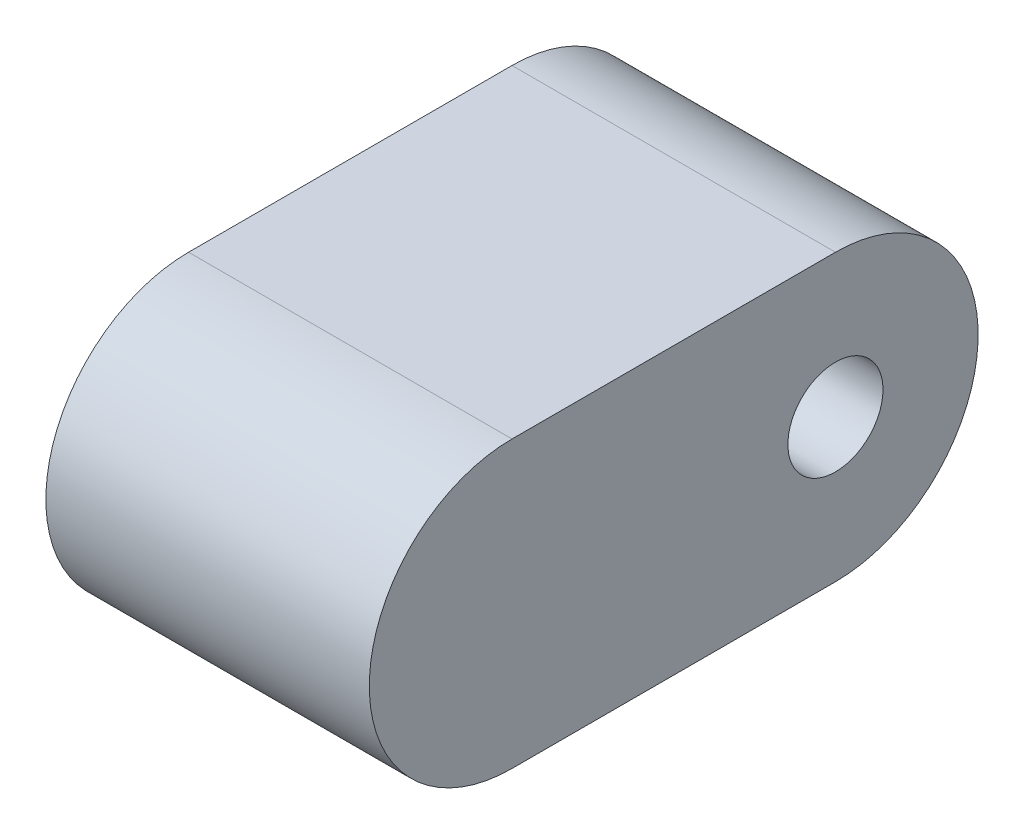
ISO-10303-21;
HEADER;
FILE_DESCRIPTION(('STEP AP214'),'2;1');
FILE_NAME('part.step','',(''),(''),'','','');
FILE_SCHEMA(('AUTOMOTIVE_DESIGN { 1 0 10303 214 1 1 1 1 }'));
ENDSEC;
DATA;
#1=APPLICATION_CONTEXT('core data for automotive mechanical design processes');
#2=APPLICATION_PROTOCOL_DEFINITION('international standard','automotive_design',2000,#1);
#3=PRODUCT_CONTEXT('',#1,'mechanical');
#4=PRODUCT('Part','Part','',(#3));
#5=PRODUCT_RELATED_PRODUCT_CATEGORY('part','',(#4));
#6=PRODUCT_DEFINITION_FORMATION('','',#4);
#7=PRODUCT_DEFINITION_CONTEXT('part definition',#1,'design');
#8=PRODUCT_DEFINITION('design','',#6,#7);
#9=PRODUCT_DEFINITION_SHAPE('','',#8);
#10=(LENGTH_UNIT() NAMED_UNIT(*) SI_UNIT(.MILLI.,.METRE.));
#11=(NAMED_UNIT(*) PLANE_ANGLE_UNIT() SI_UNIT($,.RADIAN.));
#12=(NAMED_UNIT(*) SI_UNIT($,.STERADIAN.) SOLID_ANGLE_UNIT());
#13=UNCERTAINTY_MEASURE_WITH_UNIT(LENGTH_MEASURE(1.E-05),#10,'distance_accuracy_value','');
#14=(GEOMETRIC_REPRESENTATION_CONTEXT(3) GLOBAL_UNCERTAINTY_ASSIGNED_CONTEXT((#13)) GLOBAL_UNIT_ASSIGNED_CONTEXT((#10,
#11,#12)) REPRESENTATION_CONTEXT('',''));
#15=CARTESIAN_POINT('',(0.,0.,0.));
#16=DIRECTION('',(0.,0.,1.));
#17=DIRECTION('',(1.,0.,0.));
#18=AXIS2_PLACEMENT_3D('',#15,#16,#17);
#19=CARTESIAN_POINT('',(8.5,0.,17.));
#20=DIRECTION('',(1.,0.,0.));
#21=DIRECTION('',(0.,0.,-1.));
#22=AXIS2_PLACEMENT_3D('',#19,#20,#21);
#23=PLANE('',#22);
#24=CARTESIAN_POINT('',(8.5,0.,17.));
#25=DIRECTION('',(1.,0.,0.));
#26=DIRECTION('',(0.,0.,-1.));
#27=AXIS2_PLACEMENT_3D('',#24,#25,#26);
#28=CIRCLE('',#27,7.5);
#29=CARTESIAN_POINT('',(8.5,7.5,17.));
#30=VERTEX_POINT('',#29);
#31=CARTESIAN_POINT('',(8.5,-7.5,17.));
#32=VERTEX_POINT('',#31);
#33=EDGE_CURVE('E85',#30,#32,#28,.T.);
#34=ORIENTED_EDGE('',*,*,#33,.T.);
#35=DIRECTION('',(0.,0.,-1.));
#36=VECTOR('',#35,1.);
#37=CARTESIAN_POINT('',(8.5,-7.5,0.));
#38=LINE('',#37,#36);
#39=CARTESIAN_POINT('',(8.5,-7.5,0.));
#40=VERTEX_POINT('',#39);
#41=EDGE_CURVE('E80',#32,#40,#38,.T.);
#42=ORIENTED_EDGE('',*,*,#41,.T.);
#43=CARTESIAN_POINT('',(8.5,0.,0.));
#44=DIRECTION('',(1.,0.,0.));
#45=DIRECTION('',(0.,0.,-1.));
#46=AXIS2_PLACEMENT_3D('',#43,#44,#45);
#47=CIRCLE('',#46,7.5);
#48=CARTESIAN_POINT('',(8.5,7.5,0.));
#49=VERTEX_POINT('',#48);
#50=EDGE_CURVE('E83',#40,#49,#47,.T.);
#51=ORIENTED_EDGE('',*,*,#50,.T.);
#52=DIRECTION('',(0.,0.,1.));
#53=VECTOR('',#52,1.);
#54=CARTESIAN_POINT('',(8.5,7.5,0.));
#55=LINE('',#54,#53);
#56=EDGE_CURVE('E50',#49,#30,#55,.T.);
#57=ORIENTED_EDGE('',*,*,#56,.T.);
#58=EDGE_LOOP('',(#34,#42,#51,#57));
#59=FACE_BOUND('',#58,.T.);
#60=CARTESIAN_POINT('',(8.5,0.,0.));
#61=DIRECTION('',(1.,0.,0.));
#62=DIRECTION('',(0.,0.,-1.));
#63=AXIS2_PLACEMENT_3D('',#60,#61,#62);
#64=CIRCLE('',#63,2.5);
#65=CARTESIAN_POINT('',(8.5,0.,-2.5));
#66=VERTEX_POINT('',#65);
#67=EDGE_CURVE('E100',#66,#66,#64,.T.);
#68=ORIENTED_EDGE('',*,*,#67,.F.);
#69=EDGE_LOOP('',(#68));
#70=FACE_BOUND('',#69,.T.);
#71=ADVANCED_FACE('F33',(#59,#70),#23,.T.);
#72=CARTESIAN_POINT('',(-8.5,0.,17.));
#73=DIRECTION('',(1.,0.,0.));
#74=DIRECTION('',(0.,0.,-1.));
#75=AXIS2_PLACEMENT_3D('',#72,#73,#74);
#76=PLANE('',#75);
#77=CARTESIAN_POINT('',(-8.5,0.,17.));
#78=DIRECTION('',(1.,0.,0.));
#79=DIRECTION('',(0.,0.,-1.));
#80=AXIS2_PLACEMENT_3D('',#77,#78,#79);
#81=CIRCLE('',#80,7.5);
#82=CARTESIAN_POINT('',(-8.5,7.5,17.));
#83=VERTEX_POINT('',#82);
#84=CARTESIAN_POINT('',(-8.5,-7.5,17.));
#85=VERTEX_POINT('',#84);
#86=EDGE_CURVE('E97',#83,#85,#81,.T.);
#87=ORIENTED_EDGE('',*,*,#86,.F.);
#88=DIRECTION('',(0.,0.,1.));
#89=VECTOR('',#88,1.);
#90=CARTESIAN_POINT('',(-8.5,7.5,0.));
#91=LINE('',#90,#89);
#92=CARTESIAN_POINT('',(-8.5,7.5,0.));
#93=VERTEX_POINT('',#92);
#94=EDGE_CURVE('E73',#93,#83,#91,.T.);
#95=ORIENTED_EDGE('',*,*,#94,.F.);
#96=CARTESIAN_POINT('',(-8.5,0.,0.));
#97=DIRECTION('',(1.,0.,0.));
#98=DIRECTION('',(0.,0.,-1.));
#99=AXIS2_PLACEMENT_3D('',#96,#97,#98);
#100=CIRCLE('',#99,7.5);
#101=CARTESIAN_POINT('',(-8.5,-7.5,0.));
#102=VERTEX_POINT('',#101);
#103=EDGE_CURVE('E67',#102,#93,#100,.T.);
#104=ORIENTED_EDGE('',*,*,#103,.F.);
#105=DIRECTION('',(0.,0.,-1.));
#106=VECTOR('',#105,1.);
#107=CARTESIAN_POINT('',(-8.5,-7.5,0.));
#108=LINE('',#107,#106);
#109=EDGE_CURVE('E89',#85,#102,#108,.T.);
#110=ORIENTED_EDGE('',*,*,#109,.F.);
#111=EDGE_LOOP('',(#87,#95,#104,#110));
#112=FACE_BOUND('',#111,.T.);
#113=CARTESIAN_POINT('',(-8.5,0.,0.));
#114=DIRECTION('',(1.,0.,0.));
#115=DIRECTION('',(0.,0.,-1.));
#116=AXIS2_PLACEMENT_3D('',#113,#114,#115);
#117=CIRCLE('',#116,2.5);
#118=CARTESIAN_POINT('',(-8.5,0.,-2.5));
#119=VERTEX_POINT('',#118);
#120=EDGE_CURVE('E112',#119,#119,#117,.T.);
#121=ORIENTED_EDGE('',*,*,#120,.T.);
#122=EDGE_LOOP('',(#121));
#123=FACE_BOUND('',#122,.T.);
#124=ADVANCED_FACE('F108',(#112,#123),#76,.F.);
#125=CARTESIAN_POINT('',(8.5,0.,17.));
#126=DIRECTION('',(-1.,0.,0.));
#127=DIRECTION('',(0.,0.,1.));
#128=AXIS2_PLACEMENT_3D('',#125,#126,#127);
#129=CYLINDRICAL_SURFACE('',#128,7.5);
#130=ORIENTED_EDGE('',*,*,#86,.T.);
#131=DIRECTION('',(-1.,0.,0.));
#132=VECTOR('',#131,1.);
#133=CARTESIAN_POINT('',(8.5,-7.5,17.));
#134=LINE('',#133,#132);
#135=EDGE_CURVE('E11',#32,#85,#134,.T.);
#136=ORIENTED_EDGE('',*,*,#135,.F.);
#137=ORIENTED_EDGE('',*,*,#33,.F.);
#138=DIRECTION('',(-1.,0.,0.));
#139=VECTOR('',#138,1.);
#140=CARTESIAN_POINT('',(8.5,7.5,17.));
#141=LINE('',#140,#139);
#142=EDGE_CURVE('E93',#30,#83,#141,.T.);
#143=ORIENTED_EDGE('',*,*,#142,.T.);
#144=EDGE_LOOP('',(#130,#136,#137,#143));
#145=FACE_BOUND('',#144,.T.);
#146=ADVANCED_FACE('F35',(#145),#129,.T.);
#147=CARTESIAN_POINT('',(8.5,-7.5,0.));
#148=DIRECTION('',(0.,1.,0.));
#149=DIRECTION('',(0.,0.,1.));
#150=AXIS2_PLACEMENT_3D('',#147,#148,#149);
#151=PLANE('',#150);
#152=ORIENTED_EDGE('',*,*,#109,.T.);
#153=DIRECTION('',(-1.,0.,0.));
#154=VECTOR('',#153,1.);
#155=CARTESIAN_POINT('',(8.5,-7.5,0.));
#156=LINE('',#155,#154);
#157=EDGE_CURVE('E42',#40,#102,#156,.T.);
#158=ORIENTED_EDGE('',*,*,#157,.F.);
#159=ORIENTED_EDGE('',*,*,#41,.F.);
#160=ORIENTED_EDGE('',*,*,#135,.T.);
#161=EDGE_LOOP('',(#152,#158,#159,#160));
#162=FACE_BOUND('',#161,.T.);
#163=ADVANCED_FACE('F88',(#162),#151,.F.);
#164=CARTESIAN_POINT('',(8.5,0.,0.));
#165=DIRECTION('',(-1.,0.,0.));
#166=DIRECTION('',(0.,0.,1.));
#167=AXIS2_PLACEMENT_3D('',#164,#165,#166);
#168=CYLINDRICAL_SURFACE('',#167,7.5);
#169=ORIENTED_EDGE('',*,*,#103,.T.);
#170=DIRECTION('',(-1.,0.,0.));
#171=VECTOR('',#170,1.);
#172=CARTESIAN_POINT('',(8.5,7.5,0.));
#173=LINE('',#172,#171);
#174=EDGE_CURVE('E90',#49,#93,#173,.T.);
#175=ORIENTED_EDGE('',*,*,#174,.F.);
#176=ORIENTED_EDGE('',*,*,#50,.F.);
#177=ORIENTED_EDGE('',*,*,#157,.T.);
#178=EDGE_LOOP('',(#169,#175,#176,#177));
#179=FACE_BOUND('',#178,.T.);
#180=ADVANCED_FACE('F91',(#179),#168,.T.);
#181=CARTESIAN_POINT('',(8.5,7.5,0.));
#182=DIRECTION('',(0.,-1.,0.));
#183=DIRECTION('',(0.,0.,-1.));
#184=AXIS2_PLACEMENT_3D('',#181,#182,#183);
#185=PLANE('',#184);
#186=ORIENTED_EDGE('',*,*,#94,.T.);
#187=ORIENTED_EDGE('',*,*,#142,.F.);
#188=ORIENTED_EDGE('',*,*,#56,.F.);
#189=ORIENTED_EDGE('',*,*,#174,.T.);
#190=EDGE_LOOP('',(#186,#187,#188,#189));
#191=FACE_BOUND('',#190,.T.);
#192=ADVANCED_FACE('F105',(#191),#185,.F.);
#193=CARTESIAN_POINT('',(8.5,0.,0.));
#194=DIRECTION('',(-1.,0.,0.));
#195=DIRECTION('',(0.,0.,1.));
#196=AXIS2_PLACEMENT_3D('',#193,#194,#195);
#197=CYLINDRICAL_SURFACE('',#196,2.5);
#198=ORIENTED_EDGE('',*,*,#67,.T.);
#199=EDGE_LOOP('',(#198));
#200=FACE_BOUND('',#199,.T.);
#201=ORIENTED_EDGE('',*,*,#120,.F.);
#202=EDGE_LOOP('',(#201));
#203=FACE_BOUND('',#202,.T.);
#204=ADVANCED_FACE('F118',(#200,#203),#197,.F.);
#205=CLOSED_SHELL('',(#71,#124,#146,#163,#180,#192,#204));
#206=MANIFOLD_SOLID_BREP('B2',#205);
#207=ADVANCED_BREP_SHAPE_REPRESENTATION('',(#18,#206),#14);
#208=SHAPE_DEFINITION_REPRESENTATION(#9,#207);
ENDSEC;
END-ISO-10303-21;
